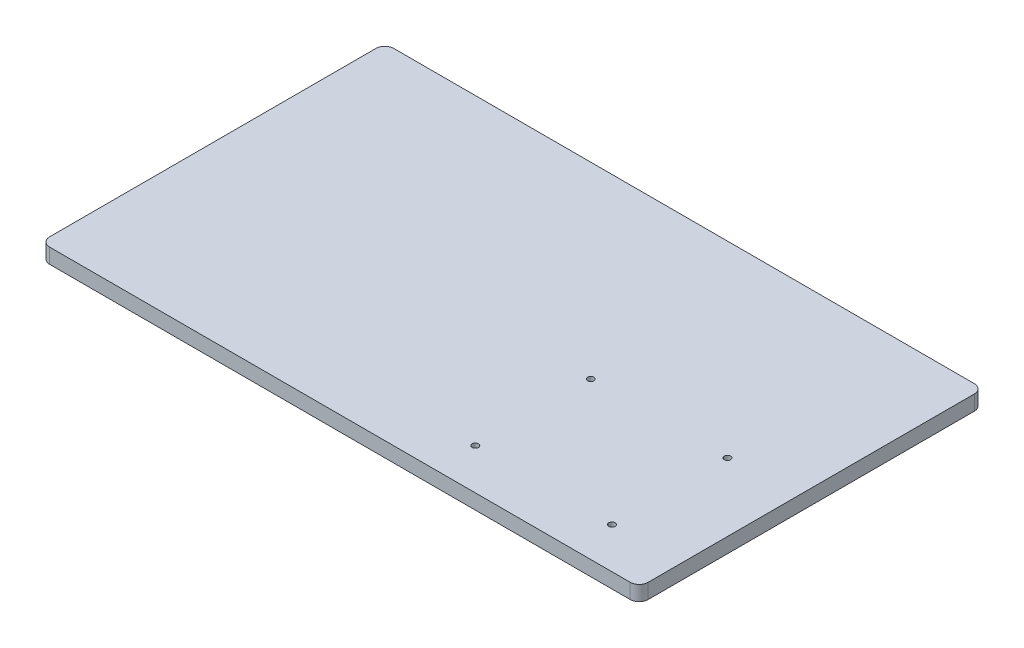
ISO-10303-21;
HEADER;
FILE_DESCRIPTION(('STEP AP214'),'2;1');
FILE_NAME('part.step','',(''),(''),'','','');
FILE_SCHEMA(('AUTOMOTIVE_DESIGN { 1 0 10303 214 1 1 1 1 }'));
ENDSEC;
DATA;
#1=APPLICATION_CONTEXT('core data for automotive mechanical design processes');
#2=APPLICATION_PROTOCOL_DEFINITION('international standard','automotive_design',2000,#1);
#3=PRODUCT_CONTEXT('',#1,'mechanical');
#4=PRODUCT('Part','Part','',(#3));
#5=PRODUCT_RELATED_PRODUCT_CATEGORY('part','',(#4));
#6=PRODUCT_DEFINITION_FORMATION('','',#4);
#7=PRODUCT_DEFINITION_CONTEXT('part definition',#1,'design');
#8=PRODUCT_DEFINITION('design','',#6,#7);
#9=PRODUCT_DEFINITION_SHAPE('','',#8);
#10=(LENGTH_UNIT() NAMED_UNIT(*) SI_UNIT(.MILLI.,.METRE.));
#11=(NAMED_UNIT(*) PLANE_ANGLE_UNIT() SI_UNIT($,.RADIAN.));
#12=(NAMED_UNIT(*) SI_UNIT($,.STERADIAN.) SOLID_ANGLE_UNIT());
#13=UNCERTAINTY_MEASURE_WITH_UNIT(LENGTH_MEASURE(1.E-05),#10,'distance_accuracy_value','');
#14=(GEOMETRIC_REPRESENTATION_CONTEXT(3) GLOBAL_UNCERTAINTY_ASSIGNED_CONTEXT((#13)) GLOBAL_UNIT_ASSIGNED_CONTEXT((#10,
#11,#12)) REPRESENTATION_CONTEXT('',''));
#15=CARTESIAN_POINT('',(0.,0.,0.));
#16=DIRECTION('',(0.,0.,1.));
#17=DIRECTION('',(1.,0.,0.));
#18=AXIS2_PLACEMENT_3D('',#15,#16,#17);
#19=CARTESIAN_POINT('',(250.19,6.35,-3.81));
#20=DIRECTION('',(0.,-1.,0.));
#21=DIRECTION('',(0.,0.,-1.));
#22=AXIS2_PLACEMENT_3D('',#19,#20,#21);
#23=CYLINDRICAL_SURFACE('',#22,3.80999999999999);
#24=CARTESIAN_POINT('',(250.19,0.,-3.81));
#25=DIRECTION('',(0.,1.,0.));
#26=DIRECTION('',(0.,0.,1.));
#27=AXIS2_PLACEMENT_3D('',#24,#25,#26);
#28=CIRCLE('',#27,3.80999999999999);
#29=CARTESIAN_POINT('',(250.19,0.,0.));
#30=VERTEX_POINT('',#29);
#31=CARTESIAN_POINT('',(254.,0.,-3.81));
#32=VERTEX_POINT('',#31);
#33=EDGE_CURVE('E130',#30,#32,#28,.T.);
#34=ORIENTED_EDGE('',*,*,#33,.T.);
#35=DIRECTION('',(0.,-1.,0.));
#36=VECTOR('',#35,1.);
#37=CARTESIAN_POINT('',(254.,6.35,-3.81));
#38=LINE('',#37,#36);
#39=CARTESIAN_POINT('',(254.,6.35,-3.81));
#40=VERTEX_POINT('',#39);
#41=EDGE_CURVE('E11',#40,#32,#38,.T.);
#42=ORIENTED_EDGE('',*,*,#41,.F.);
#43=CARTESIAN_POINT('',(250.19,6.35,-3.81));
#44=DIRECTION('',(0.,1.,0.));
#45=DIRECTION('',(0.,0.,1.));
#46=AXIS2_PLACEMENT_3D('',#43,#44,#45);
#47=CIRCLE('',#46,3.80999999999999);
#48=CARTESIAN_POINT('',(250.19,6.35,0.));
#49=VERTEX_POINT('',#48);
#50=EDGE_CURVE('E145',#49,#40,#47,.T.);
#51=ORIENTED_EDGE('',*,*,#50,.F.);
#52=DIRECTION('',(0.,-1.,0.));
#53=VECTOR('',#52,1.);
#54=CARTESIAN_POINT('',(250.19,6.35,0.));
#55=LINE('',#54,#53);
#56=EDGE_CURVE('E126',#49,#30,#55,.T.);
#57=ORIENTED_EDGE('',*,*,#56,.T.);
#58=EDGE_LOOP('',(#34,#42,#51,#57));
#59=FACE_BOUND('',#58,.T.);
#60=ADVANCED_FACE('F34',(#59),#23,.T.);
#61=CARTESIAN_POINT('',(254.,6.35,-3.81));
#62=DIRECTION('',(-1.,0.,0.));
#63=DIRECTION('',(0.,0.,1.));
#64=AXIS2_PLACEMENT_3D('',#61,#62,#63);
#65=PLANE('',#64);
#66=DIRECTION('',(0.,0.,-1.));
#67=VECTOR('',#66,1.);
#68=CARTESIAN_POINT('',(254.,0.,-3.81));
#69=LINE('',#68,#67);
#70=CARTESIAN_POINT('',(254.,0.,-142.24));
#71=VERTEX_POINT('',#70);
#72=EDGE_CURVE('E133',#32,#71,#69,.T.);
#73=ORIENTED_EDGE('',*,*,#72,.T.);
#74=DIRECTION('',(0.,-1.,0.));
#75=VECTOR('',#74,1.);
#76=CARTESIAN_POINT('',(254.,6.35,-142.24));
#77=LINE('',#76,#75);
#78=CARTESIAN_POINT('',(254.,6.35,-142.24));
#79=VERTEX_POINT('',#78);
#80=EDGE_CURVE('E42',#79,#71,#77,.T.);
#81=ORIENTED_EDGE('',*,*,#80,.F.);
#82=DIRECTION('',(0.,0.,-1.));
#83=VECTOR('',#82,1.);
#84=CARTESIAN_POINT('',(254.,6.35,-3.81));
#85=LINE('',#84,#83);
#86=EDGE_CURVE('E93',#40,#79,#85,.T.);
#87=ORIENTED_EDGE('',*,*,#86,.F.);
#88=ORIENTED_EDGE('',*,*,#41,.T.);
#89=EDGE_LOOP('',(#73,#81,#87,#88));
#90=FACE_BOUND('',#89,.T.);
#91=ADVANCED_FACE('F230',(#90),#65,.F.);
#92=CARTESIAN_POINT('',(250.19,6.35,-142.24));
#93=DIRECTION('',(0.,-1.,0.));
#94=DIRECTION('',(0.,0.,-1.));
#95=AXIS2_PLACEMENT_3D('',#92,#93,#94);
#96=CYLINDRICAL_SURFACE('',#95,3.81000000000002);
#97=CARTESIAN_POINT('',(250.19,0.,-142.24));
#98=DIRECTION('',(0.,1.,0.));
#99=DIRECTION('',(0.,0.,-1.));
#100=AXIS2_PLACEMENT_3D('',#97,#98,#99);
#101=CIRCLE('',#100,3.81000000000002);
#102=CARTESIAN_POINT('',(250.19,0.,-146.05));
#103=VERTEX_POINT('',#102);
#104=EDGE_CURVE('E136',#71,#103,#101,.T.);
#105=ORIENTED_EDGE('',*,*,#104,.T.);
#106=DIRECTION('',(0.,-1.,0.));
#107=VECTOR('',#106,1.);
#108=CARTESIAN_POINT('',(250.19,6.35,-146.05));
#109=LINE('',#108,#107);
#110=CARTESIAN_POINT('',(250.19,6.35,-146.05));
#111=VERTEX_POINT('',#110);
#112=EDGE_CURVE('E152',#111,#103,#109,.T.);
#113=ORIENTED_EDGE('',*,*,#112,.F.);
#114=CARTESIAN_POINT('',(250.19,6.35,-142.24));
#115=DIRECTION('',(0.,1.,0.));
#116=DIRECTION('',(0.,0.,-1.));
#117=AXIS2_PLACEMENT_3D('',#114,#115,#116);
#118=CIRCLE('',#117,3.81000000000002);
#119=EDGE_CURVE('E160',#79,#111,#118,.T.);
#120=ORIENTED_EDGE('',*,*,#119,.F.);
#121=ORIENTED_EDGE('',*,*,#80,.T.);
#122=EDGE_LOOP('',(#105,#113,#120,#121));
#123=FACE_BOUND('',#122,.T.);
#124=ADVANCED_FACE('F158',(#123),#96,.T.);
#125=CARTESIAN_POINT('',(3.81,6.35,-146.05));
#126=DIRECTION('',(0.,0.,1.));
#127=DIRECTION('',(1.,0.,0.));
#128=AXIS2_PLACEMENT_3D('',#125,#126,#127);
#129=PLANE('',#128);
#130=DIRECTION('',(-1.,0.,0.));
#131=VECTOR('',#130,1.);
#132=CARTESIAN_POINT('',(3.81,0.,-146.05));
#133=LINE('',#132,#131);
#134=CARTESIAN_POINT('',(3.81,0.,-146.05));
#135=VERTEX_POINT('',#134);
#136=EDGE_CURVE('E138',#103,#135,#133,.T.);
#137=ORIENTED_EDGE('',*,*,#136,.T.);
#138=DIRECTION('',(0.,-1.,0.));
#139=VECTOR('',#138,1.);
#140=CARTESIAN_POINT('',(3.81,6.35,-146.05));
#141=LINE('',#140,#139);
#142=CARTESIAN_POINT('',(3.81,6.35,-146.05));
#143=VERTEX_POINT('',#142);
#144=EDGE_CURVE('E149',#143,#135,#141,.T.);
#145=ORIENTED_EDGE('',*,*,#144,.F.);
#146=DIRECTION('',(-1.,0.,0.));
#147=VECTOR('',#146,1.);
#148=CARTESIAN_POINT('',(3.81,6.35,-146.05));
#149=LINE('',#148,#147);
#150=EDGE_CURVE('E172',#111,#143,#149,.T.);
#151=ORIENTED_EDGE('',*,*,#150,.F.);
#152=ORIENTED_EDGE('',*,*,#112,.T.);
#153=EDGE_LOOP('',(#137,#145,#151,#152));
#154=FACE_BOUND('',#153,.T.);
#155=ADVANCED_FACE('F168',(#154),#129,.F.);
#156=CARTESIAN_POINT('',(3.81,6.35,-142.24));
#157=DIRECTION('',(0.,-1.,0.));
#158=DIRECTION('',(0.,0.,-1.));
#159=AXIS2_PLACEMENT_3D('',#156,#157,#158);
#160=CYLINDRICAL_SURFACE('',#159,3.81);
#161=CARTESIAN_POINT('',(3.81,0.,-142.24));
#162=DIRECTION('',(0.,1.,0.));
#163=DIRECTION('',(0.,0.,-1.));
#164=AXIS2_PLACEMENT_3D('',#161,#162,#163);
#165=CIRCLE('',#164,3.81);
#166=CARTESIAN_POINT('',(0.,0.,-142.24));
#167=VERTEX_POINT('',#166);
#168=EDGE_CURVE('E140',#135,#167,#165,.T.);
#169=ORIENTED_EDGE('',*,*,#168,.T.);
#170=DIRECTION('',(0.,-1.,0.));
#171=VECTOR('',#170,1.);
#172=CARTESIAN_POINT('',(0.,6.35,-142.24));
#173=LINE('',#172,#171);
#174=CARTESIAN_POINT('',(0.,6.35,-142.24));
#175=VERTEX_POINT('',#174);
#176=EDGE_CURVE('E121',#175,#167,#173,.T.);
#177=ORIENTED_EDGE('',*,*,#176,.F.);
#178=CARTESIAN_POINT('',(3.81,6.35,-142.24));
#179=DIRECTION('',(0.,1.,0.));
#180=DIRECTION('',(0.,0.,-1.));
#181=AXIS2_PLACEMENT_3D('',#178,#179,#180);
#182=CIRCLE('',#181,3.81);
#183=EDGE_CURVE('E112',#143,#175,#182,.T.);
#184=ORIENTED_EDGE('',*,*,#183,.F.);
#185=ORIENTED_EDGE('',*,*,#144,.T.);
#186=EDGE_LOOP('',(#169,#177,#184,#185));
#187=FACE_BOUND('',#186,.T.);
#188=ADVANCED_FACE('F171',(#187),#160,.T.);
#189=CARTESIAN_POINT('',(0.,6.35,-3.81000000000003));
#190=DIRECTION('',(1.,0.,0.));
#191=DIRECTION('',(0.,0.,-1.));
#192=AXIS2_PLACEMENT_3D('',#189,#190,#191);
#193=PLANE('',#192);
#194=DIRECTION('',(0.,0.,1.));
#195=VECTOR('',#194,1.);
#196=CARTESIAN_POINT('',(0.,0.,-3.81000000000003));
#197=LINE('',#196,#195);
#198=CARTESIAN_POINT('',(0.,0.,-3.81000000000003));
#199=VERTEX_POINT('',#198);
#200=EDGE_CURVE('E120',#167,#199,#197,.T.);
#201=ORIENTED_EDGE('',*,*,#200,.T.);
#202=DIRECTION('',(0.,-1.,0.));
#203=VECTOR('',#202,1.);
#204=CARTESIAN_POINT('',(0.,6.35,-3.81000000000003));
#205=LINE('',#204,#203);
#206=CARTESIAN_POINT('',(0.,6.35,-3.81000000000003));
#207=VERTEX_POINT('',#206);
#208=EDGE_CURVE('E117',#207,#199,#205,.T.);
#209=ORIENTED_EDGE('',*,*,#208,.F.);
#210=DIRECTION('',(0.,0.,1.));
#211=VECTOR('',#210,1.);
#212=CARTESIAN_POINT('',(0.,6.35,-3.81000000000003));
#213=LINE('',#212,#211);
#214=EDGE_CURVE('E106',#175,#207,#213,.T.);
#215=ORIENTED_EDGE('',*,*,#214,.F.);
#216=ORIENTED_EDGE('',*,*,#176,.T.);
#217=EDGE_LOOP('',(#201,#209,#215,#216));
#218=FACE_BOUND('',#217,.T.);
#219=ADVANCED_FACE('F118',(#218),#193,.F.);
#220=CARTESIAN_POINT('',(3.81,6.35,-3.81));
#221=DIRECTION('',(0.,-1.,0.));
#222=DIRECTION('',(0.,0.,-1.));
#223=AXIS2_PLACEMENT_3D('',#220,#221,#222);
#224=CYLINDRICAL_SURFACE('',#223,3.81);
#225=CARTESIAN_POINT('',(3.81,0.,-3.81));
#226=DIRECTION('',(0.,1.,0.));
#227=DIRECTION('',(0.,0.,-1.));
#228=AXIS2_PLACEMENT_3D('',#225,#226,#227);
#229=CIRCLE('',#228,3.81);
#230=CARTESIAN_POINT('',(3.81000000000003,0.,0.));
#231=VERTEX_POINT('',#230);
#232=EDGE_CURVE('E79',#199,#231,#229,.T.);
#233=ORIENTED_EDGE('',*,*,#232,.T.);
#234=DIRECTION('',(0.,-1.,0.));
#235=VECTOR('',#234,1.);
#236=CARTESIAN_POINT('',(3.81000000000003,6.35,0.));
#237=LINE('',#236,#235);
#238=CARTESIAN_POINT('',(3.81000000000003,6.35,0.));
#239=VERTEX_POINT('',#238);
#240=EDGE_CURVE('E122',#239,#231,#237,.T.);
#241=ORIENTED_EDGE('',*,*,#240,.F.);
#242=CARTESIAN_POINT('',(3.81,6.35,-3.81));
#243=DIRECTION('',(0.,1.,0.));
#244=DIRECTION('',(0.,0.,-1.));
#245=AXIS2_PLACEMENT_3D('',#242,#243,#244);
#246=CIRCLE('',#245,3.81);
#247=EDGE_CURVE('E110',#207,#239,#246,.T.);
#248=ORIENTED_EDGE('',*,*,#247,.F.);
#249=ORIENTED_EDGE('',*,*,#208,.T.);
#250=EDGE_LOOP('',(#233,#241,#248,#249));
#251=FACE_BOUND('',#250,.T.);
#252=ADVANCED_FACE('F124',(#251),#224,.T.);
#253=CARTESIAN_POINT('',(3.81000000000003,6.35,0.));
#254=DIRECTION('',(0.,0.,-1.));
#255=DIRECTION('',(-1.,0.,0.));
#256=AXIS2_PLACEMENT_3D('',#253,#254,#255);
#257=PLANE('',#256);
#258=DIRECTION('',(1.,0.,0.));
#259=VECTOR('',#258,1.);
#260=CARTESIAN_POINT('',(3.81000000000003,0.,0.));
#261=LINE('',#260,#259);
#262=EDGE_CURVE('E85',#231,#30,#261,.T.);
#263=ORIENTED_EDGE('',*,*,#262,.T.);
#264=ORIENTED_EDGE('',*,*,#56,.F.);
#265=DIRECTION('',(1.,0.,0.));
#266=VECTOR('',#265,1.);
#267=CARTESIAN_POINT('',(3.81000000000003,6.35,0.));
#268=LINE('',#267,#266);
#269=EDGE_CURVE('E50',#239,#49,#268,.T.);
#270=ORIENTED_EDGE('',*,*,#269,.F.);
#271=ORIENTED_EDGE('',*,*,#240,.T.);
#272=EDGE_LOOP('',(#263,#264,#270,#271));
#273=FACE_BOUND('',#272,.T.);
#274=ADVANCED_FACE('F214',(#273),#257,.F.);
#275=CARTESIAN_POINT('',(250.19,6.35,-3.81));
#276=DIRECTION('',(0.,1.,0.));
#277=DIRECTION('',(0.,0.,1.));
#278=AXIS2_PLACEMENT_3D('',#275,#276,#277);
#279=PLANE('',#278);
#280=CARTESIAN_POINT('',(167.1,6.35,-66.3499999999999));
#281=DIRECTION('',(0.,1.,0.));
#282=DIRECTION('',(0.,0.,1.));
#283=AXIS2_PLACEMENT_3D('',#280,#281,#282);
#284=CIRCLE('',#283,1.35000000000001);
#285=CARTESIAN_POINT('',(167.1,6.35,-64.9999999999999));
#286=VERTEX_POINT('',#285);
#287=EDGE_CURVE('E191',#286,#286,#284,.T.);
#288=ORIENTED_EDGE('',*,*,#287,.F.);
#289=EDGE_LOOP('',(#288));
#290=FACE_BOUND('',#289,.T.);
#291=CARTESIAN_POINT('',(225.1,6.35,-17.3499999999999));
#292=DIRECTION('',(0.,1.,0.));
#293=DIRECTION('',(0.,0.,1.));
#294=AXIS2_PLACEMENT_3D('',#291,#292,#293);
#295=CIRCLE('',#294,1.34999999999995);
#296=CARTESIAN_POINT('',(225.1,6.35,-16.));
#297=VERTEX_POINT('',#296);
#298=EDGE_CURVE('E184',#297,#297,#295,.T.);
#299=ORIENTED_EDGE('',*,*,#298,.F.);
#300=EDGE_LOOP('',(#299));
#301=FACE_BOUND('',#300,.T.);
#302=CARTESIAN_POINT('',(225.1,6.35,-66.3499999999999));
#303=DIRECTION('',(0.,1.,0.));
#304=DIRECTION('',(0.,0.,1.));
#305=AXIS2_PLACEMENT_3D('',#302,#303,#304);
#306=CIRCLE('',#305,1.34999999999998);
#307=CARTESIAN_POINT('',(225.1,6.35,-65.));
#308=VERTEX_POINT('',#307);
#309=EDGE_CURVE('E196',#308,#308,#306,.T.);
#310=ORIENTED_EDGE('',*,*,#309,.F.);
#311=EDGE_LOOP('',(#310));
#312=FACE_BOUND('',#311,.T.);
#313=CARTESIAN_POINT('',(167.1,6.35,-17.3499999999999));
#314=DIRECTION('',(0.,1.,0.));
#315=DIRECTION('',(0.,0.,1.));
#316=AXIS2_PLACEMENT_3D('',#313,#314,#315);
#317=CIRCLE('',#316,1.34999999999998);
#318=CARTESIAN_POINT('',(167.1,6.35,-16.));
#319=VERTEX_POINT('',#318);
#320=EDGE_CURVE('E178',#319,#319,#317,.T.);
#321=ORIENTED_EDGE('',*,*,#320,.F.);
#322=EDGE_LOOP('',(#321));
#323=FACE_BOUND('',#322,.T.);
#324=ORIENTED_EDGE('',*,*,#50,.T.);
#325=ORIENTED_EDGE('',*,*,#86,.T.);
#326=ORIENTED_EDGE('',*,*,#119,.T.);
#327=ORIENTED_EDGE('',*,*,#150,.T.);
#328=ORIENTED_EDGE('',*,*,#183,.T.);
#329=ORIENTED_EDGE('',*,*,#214,.T.);
#330=ORIENTED_EDGE('',*,*,#247,.T.);
#331=ORIENTED_EDGE('',*,*,#269,.T.);
#332=EDGE_LOOP('',(#324,#325,#326,#327,#328,#329,#330,#331));
#333=FACE_BOUND('',#332,.T.);
#334=ADVANCED_FACE('F108',(#290,#301,#312,#323,#333),#279,.T.);
#335=CARTESIAN_POINT('',(250.19,0.,-3.81));
#336=DIRECTION('',(0.,1.,0.));
#337=DIRECTION('',(0.,0.,1.));
#338=AXIS2_PLACEMENT_3D('',#335,#336,#337);
#339=PLANE('',#338);
#340=CARTESIAN_POINT('',(167.1,0.,-66.3499999999999));
#341=DIRECTION('',(0.,1.,0.));
#342=DIRECTION('',(0.,0.,1.));
#343=AXIS2_PLACEMENT_3D('',#340,#341,#342);
#344=CIRCLE('',#343,1.35000000000001);
#345=CARTESIAN_POINT('',(167.1,0.,-64.9999999999999));
#346=VERTEX_POINT('',#345);
#347=EDGE_CURVE('E181',#346,#346,#344,.T.);
#348=ORIENTED_EDGE('',*,*,#347,.T.);
#349=EDGE_LOOP('',(#348));
#350=FACE_BOUND('',#349,.T.);
#351=CARTESIAN_POINT('',(225.1,0.,-17.3499999999999));
#352=DIRECTION('',(0.,1.,0.));
#353=DIRECTION('',(0.,0.,1.));
#354=AXIS2_PLACEMENT_3D('',#351,#352,#353);
#355=CIRCLE('',#354,1.34999999999995);
#356=CARTESIAN_POINT('',(225.1,0.,-16.));
#357=VERTEX_POINT('',#356);
#358=EDGE_CURVE('E187',#357,#357,#355,.T.);
#359=ORIENTED_EDGE('',*,*,#358,.T.);
#360=EDGE_LOOP('',(#359));
#361=FACE_BOUND('',#360,.T.);
#362=CARTESIAN_POINT('',(225.1,0.,-66.3499999999999));
#363=DIRECTION('',(0.,1.,0.));
#364=DIRECTION('',(0.,0.,1.));
#365=AXIS2_PLACEMENT_3D('',#362,#363,#364);
#366=CIRCLE('',#365,1.34999999999998);
#367=CARTESIAN_POINT('',(225.1,0.,-65.));
#368=VERTEX_POINT('',#367);
#369=EDGE_CURVE('E188',#368,#368,#366,.T.);
#370=ORIENTED_EDGE('',*,*,#369,.T.);
#371=EDGE_LOOP('',(#370));
#372=FACE_BOUND('',#371,.T.);
#373=CARTESIAN_POINT('',(167.1,0.,-17.3499999999999));
#374=DIRECTION('',(0.,1.,0.));
#375=DIRECTION('',(0.,0.,1.));
#376=AXIS2_PLACEMENT_3D('',#373,#374,#375);
#377=CIRCLE('',#376,1.34999999999998);
#378=CARTESIAN_POINT('',(167.1,0.,-16.));
#379=VERTEX_POINT('',#378);
#380=EDGE_CURVE('E134',#379,#379,#377,.T.);
#381=ORIENTED_EDGE('',*,*,#380,.T.);
#382=EDGE_LOOP('',(#381));
#383=FACE_BOUND('',#382,.T.);
#384=ORIENTED_EDGE('',*,*,#33,.F.);
#385=ORIENTED_EDGE('',*,*,#262,.F.);
#386=ORIENTED_EDGE('',*,*,#232,.F.);
#387=ORIENTED_EDGE('',*,*,#200,.F.);
#388=ORIENTED_EDGE('',*,*,#168,.F.);
#389=ORIENTED_EDGE('',*,*,#136,.F.);
#390=ORIENTED_EDGE('',*,*,#104,.F.);
#391=ORIENTED_EDGE('',*,*,#72,.F.);
#392=EDGE_LOOP('',(#384,#385,#386,#387,#388,#389,#390,#391));
#393=FACE_BOUND('',#392,.T.);
#394=ADVANCED_FACE('F164',(#350,#361,#372,#383,#393),#339,.F.);
#395=CARTESIAN_POINT('',(167.1,0.,-17.3499999999999));
#396=DIRECTION('',(0.,1.,0.));
#397=DIRECTION('',(0.,0.,1.));
#398=AXIS2_PLACEMENT_3D('',#395,#396,#397);
#399=CYLINDRICAL_SURFACE('',#398,1.34999999999998);
#400=ORIENTED_EDGE('',*,*,#380,.F.);
#401=EDGE_LOOP('',(#400));
#402=FACE_BOUND('',#401,.T.);
#403=ORIENTED_EDGE('',*,*,#320,.T.);
#404=EDGE_LOOP('',(#403));
#405=FACE_BOUND('',#404,.T.);
#406=ADVANCED_FACE('F208',(#402,#405),#399,.F.);
#407=CARTESIAN_POINT('',(225.1,0.,-66.3499999999999));
#408=DIRECTION('',(0.,1.,0.));
#409=DIRECTION('',(0.,0.,1.));
#410=AXIS2_PLACEMENT_3D('',#407,#408,#409);
#411=CYLINDRICAL_SURFACE('',#410,1.34999999999998);
#412=ORIENTED_EDGE('',*,*,#369,.F.);
#413=EDGE_LOOP('',(#412));
#414=FACE_BOUND('',#413,.T.);
#415=ORIENTED_EDGE('',*,*,#309,.T.);
#416=EDGE_LOOP('',(#415));
#417=FACE_BOUND('',#416,.T.);
#418=ADVANCED_FACE('F204',(#414,#417),#411,.F.);
#419=CARTESIAN_POINT('',(225.1,0.,-17.3499999999999));
#420=DIRECTION('',(0.,1.,0.));
#421=DIRECTION('',(0.,0.,1.));
#422=AXIS2_PLACEMENT_3D('',#419,#420,#421);
#423=CYLINDRICAL_SURFACE('',#422,1.34999999999995);
#424=ORIENTED_EDGE('',*,*,#358,.F.);
#425=EDGE_LOOP('',(#424));
#426=FACE_BOUND('',#425,.T.);
#427=ORIENTED_EDGE('',*,*,#298,.T.);
#428=EDGE_LOOP('',(#427));
#429=FACE_BOUND('',#428,.T.);
#430=ADVANCED_FACE('F207',(#426,#429),#423,.F.);
#431=CARTESIAN_POINT('',(167.1,0.,-66.3499999999999));
#432=DIRECTION('',(0.,1.,0.));
#433=DIRECTION('',(0.,0.,1.));
#434=AXIS2_PLACEMENT_3D('',#431,#432,#433);
#435=CYLINDRICAL_SURFACE('',#434,1.35000000000001);
#436=ORIENTED_EDGE('',*,*,#347,.F.);
#437=EDGE_LOOP('',(#436));
#438=FACE_BOUND('',#437,.T.);
#439=ORIENTED_EDGE('',*,*,#287,.T.);
#440=EDGE_LOOP('',(#439));
#441=FACE_BOUND('',#440,.T.);
#442=ADVANCED_FACE('F306',(#438,#441),#435,.F.);
#443=CLOSED_SHELL('',(#60,#91,#124,#155,#188,#219,#252,#274,#334,#394,#406,#418,#430,#442));
#444=MANIFOLD_SOLID_BREP('B2',#443);
#445=ADVANCED_BREP_SHAPE_REPRESENTATION('',(#18,#444),#14);
#446=SHAPE_DEFINITION_REPRESENTATION(#9,#445);
ENDSEC;
END-ISO-10303-21;
